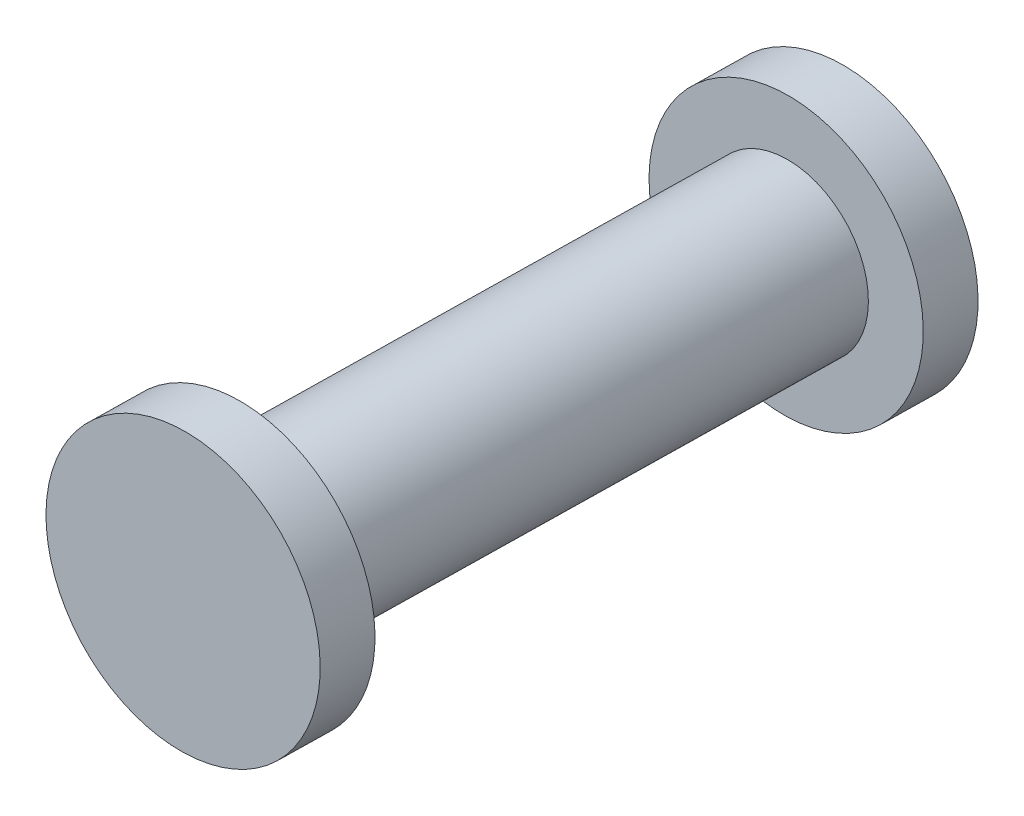
ISO-10303-21;
HEADER;
FILE_DESCRIPTION(('STEP AP214'),'2;1');
FILE_NAME('part.step','',(''),(''),'','','');
FILE_SCHEMA(('AUTOMOTIVE_DESIGN { 1 0 10303 214 1 1 1 1 }'));
ENDSEC;
DATA;
#1=APPLICATION_CONTEXT('core data for automotive mechanical design processes');
#2=APPLICATION_PROTOCOL_DEFINITION('international standard','automotive_design',2000,#1);
#3=PRODUCT_CONTEXT('',#1,'mechanical');
#4=PRODUCT('Part','Part','',(#3));
#5=PRODUCT_RELATED_PRODUCT_CATEGORY('part','',(#4));
#6=PRODUCT_DEFINITION_FORMATION('','',#4);
#7=PRODUCT_DEFINITION_CONTEXT('part definition',#1,'design');
#8=PRODUCT_DEFINITION('design','',#6,#7);
#9=PRODUCT_DEFINITION_SHAPE('','',#8);
#10=(LENGTH_UNIT() NAMED_UNIT(*) SI_UNIT(.MILLI.,.METRE.));
#11=(NAMED_UNIT(*) PLANE_ANGLE_UNIT() SI_UNIT($,.RADIAN.));
#12=(NAMED_UNIT(*) SI_UNIT($,.STERADIAN.) SOLID_ANGLE_UNIT());
#13=UNCERTAINTY_MEASURE_WITH_UNIT(LENGTH_MEASURE(1.E-05),#10,'distance_accuracy_value','');
#14=(GEOMETRIC_REPRESENTATION_CONTEXT(3) GLOBAL_UNCERTAINTY_ASSIGNED_CONTEXT((#13)) GLOBAL_UNIT_ASSIGNED_CONTEXT((#10,
#11,#12)) REPRESENTATION_CONTEXT('',''));
#15=CARTESIAN_POINT('',(0.,0.,0.));
#16=DIRECTION('',(0.,0.,1.));
#17=DIRECTION('',(1.,0.,0.));
#18=AXIS2_PLACEMENT_3D('',#15,#16,#17);
#19=CARTESIAN_POINT('',(-3.32898585000269E-12,4.37821391704974,-6.95530285000219));
#20=DIRECTION('',(4.78159178918247E-13,0.0174524064370392,0.999847695156396));
#21=DIRECTION('',(1.,0.,-4.78200812281671E-13));
#22=AXIS2_PLACEMENT_3D('',#19,#20,#21);
#23=PLANE('',#22);
#24=CARTESIAN_POINT('',(-3.34985945232846E-12,6.87783315494072,-6.99893386609478));
#25=DIRECTION('',(-4.78159178918247E-13,-0.0174524064370392,-0.999847695156396));
#26=DIRECTION('',(-1.,0.,4.78200812281671E-13));
#27=AXIS2_PLACEMENT_3D('',#24,#25,#26);
#28=CIRCLE('',#27,2.5);
#29=CARTESIAN_POINT('',(-2.50000000000335,6.87783315494072,-6.99893386609359));
#30=VERTEX_POINT('',#29);
#31=EDGE_CURVE('E53',#30,#30,#28,.T.);
#32=ORIENTED_EDGE('',*,*,#31,.T.);
#33=EDGE_LOOP('',(#32));
#34=FACE_BOUND('',#33,.T.);
#35=ADVANCED_FACE('F31',(#34),#23,.F.);
#36=CARTESIAN_POINT('',(2.3880506946905E-12,7.08726203218519,4.99923847578196));
#37=DIRECTION('',(-4.78159178918247E-13,-0.0174524064370392,-0.999847695156396));
#38=DIRECTION('',(-1.,0.,4.78200812281671E-13));
#39=AXIS2_PLACEMENT_3D('',#36,#37,#38);
#40=PLANE('',#39);
#41=CARTESIAN_POINT('',(2.3880506946905E-12,7.08726203218519,4.99923847578196));
#42=DIRECTION('',(-4.78159178918247E-13,-0.0174524064370392,-0.999847695156396));
#43=DIRECTION('',(-1.,0.,4.78200812281671E-13));
#44=AXIS2_PLACEMENT_3D('',#41,#42,#43);
#45=CIRCLE('',#44,2.5);
#46=CARTESIAN_POINT('',(-2.49999999999761,7.08726203218519,4.99923847578316));
#47=VERTEX_POINT('',#46);
#48=EDGE_CURVE('E10',#47,#47,#45,.T.);
#49=ORIENTED_EDGE('',*,*,#48,.F.);
#50=EDGE_LOOP('',(#49));
#51=FACE_BOUND('',#50,.T.);
#52=ADVANCED_FACE('F83',(#51),#40,.F.);
#53=CARTESIAN_POINT('',(-3.34985945232846E-12,6.87783315494072,-6.99893386609478));
#54=DIRECTION('',(-4.78159178918247E-13,-0.0174524064370392,-0.999847695156396));
#55=DIRECTION('',(-1.,0.,4.78200812281671E-13));
#56=AXIS2_PLACEMENT_3D('',#53,#54,#55);
#57=CYLINDRICAL_SURFACE('',#56,2.5);
#58=CARTESIAN_POINT('',(1.90989151577226E-12,7.06980962574815,3.99939078062557));
#59=DIRECTION('',(-4.78159178918247E-13,-0.0174524064370392,-0.999847695156396));
#60=DIRECTION('',(-1.,0.,4.78200812281671E-13));
#61=AXIS2_PLACEMENT_3D('',#58,#59,#60);
#62=CIRCLE('',#61,2.5);
#63=CARTESIAN_POINT('',(-2.49999999999809,7.06980962574815,3.99939078062676));
#64=VERTEX_POINT('',#63);
#65=EDGE_CURVE('E37',#64,#64,#62,.T.);
#66=ORIENTED_EDGE('',*,*,#65,.F.);
#67=EDGE_LOOP('',(#66));
#68=FACE_BOUND('',#67,.T.);
#69=ORIENTED_EDGE('',*,*,#48,.T.);
#70=EDGE_LOOP('',(#69));
#71=FACE_BOUND('',#70,.T.);
#72=ADVANCED_FACE('F78',(#68,#71),#57,.T.);
#73=CARTESIAN_POINT('',(1.93076511809803E-12,4.57019038785717,4.04302179671817));
#74=DIRECTION('',(4.78159178918247E-13,0.0174524064370392,0.999847695156396));
#75=DIRECTION('',(1.,0.,-4.78200812281671E-13));
#76=AXIS2_PLACEMENT_3D('',#73,#74,#75);
#77=PLANE('',#76);
#78=CARTESIAN_POINT('',(1.90989151577226E-12,7.06980962574815,3.99939078062557));
#79=DIRECTION('',(-4.78159178918247E-13,-0.0174524064370392,-0.999847695156396));
#80=DIRECTION('',(-1.,0.,4.78200812281671E-13));
#81=AXIS2_PLACEMENT_3D('',#78,#79,#80);
#82=CIRCLE('',#81,1.5);
#83=CARTESIAN_POINT('',(-1.49999999999809,7.06980962574815,3.99939078062628));
#84=VERTEX_POINT('',#83);
#85=EDGE_CURVE('E41',#84,#84,#82,.T.);
#86=ORIENTED_EDGE('',*,*,#85,.F.);
#87=EDGE_LOOP('',(#86));
#88=FACE_BOUND('',#87,.T.);
#89=ORIENTED_EDGE('',*,*,#65,.T.);
#90=EDGE_LOOP('',(#89));
#91=FACE_BOUND('',#90,.T.);
#92=ADVANCED_FACE('F73',(#88,#91),#77,.F.);
#93=CARTESIAN_POINT('',(-3.34985945232846E-12,6.87783315494072,-6.99893386609478));
#94=DIRECTION('',(-4.78159178918247E-13,-0.0174524064370392,-0.999847695156396));
#95=DIRECTION('',(-1.,0.,4.78200812281671E-13));
#96=AXIS2_PLACEMENT_3D('',#93,#94,#95);
#97=CYLINDRICAL_SURFACE('',#96,1.5);
#98=CARTESIAN_POINT('',(-2.87170027341022E-12,6.89528556137776,-5.99908617093839));
#99=DIRECTION('',(-4.78159178918247E-13,-0.0174524064370392,-0.999847695156396));
#100=DIRECTION('',(-1.,0.,4.78200812281671E-13));
#101=AXIS2_PLACEMENT_3D('',#98,#99,#100);
#102=CIRCLE('',#101,1.5);
#103=CARTESIAN_POINT('',(-1.50000000000287,6.89528556137776,-5.99908617093767));
#104=VERTEX_POINT('',#103);
#105=EDGE_CURVE('E45',#104,#104,#102,.T.);
#106=ORIENTED_EDGE('',*,*,#105,.F.);
#107=EDGE_LOOP('',(#106));
#108=FACE_BOUND('',#107,.T.);
#109=ORIENTED_EDGE('',*,*,#85,.T.);
#110=EDGE_LOOP('',(#109));
#111=FACE_BOUND('',#110,.T.);
#112=ADVANCED_FACE('F67',(#108,#111),#97,.T.);
#113=CARTESIAN_POINT('',(-2.85917611201475E-12,5.39551401864317,-5.97290756128283));
#114=DIRECTION('',(-4.78159178918247E-13,-0.0174524064370392,-0.999847695156396));
#115=DIRECTION('',(-1.,0.,4.78200812281671E-13));
#116=AXIS2_PLACEMENT_3D('',#113,#114,#115);
#117=PLANE('',#116);
#118=CARTESIAN_POINT('',(-2.87170027341022E-12,6.89528556137776,-5.99908617093839));
#119=DIRECTION('',(-4.78159178918247E-13,-0.0174524064370392,-0.999847695156396));
#120=DIRECTION('',(-1.,0.,4.78200812281671E-13));
#121=AXIS2_PLACEMENT_3D('',#118,#119,#120);
#122=CIRCLE('',#121,2.5);
#123=CARTESIAN_POINT('',(-2.50000000000287,6.89528556137776,-5.99908617093719));
#124=VERTEX_POINT('',#123);
#125=EDGE_CURVE('E50',#124,#124,#122,.T.);
#126=ORIENTED_EDGE('',*,*,#125,.F.);
#127=EDGE_LOOP('',(#126));
#128=FACE_BOUND('',#127,.T.);
#129=ORIENTED_EDGE('',*,*,#105,.T.);
#130=EDGE_LOOP('',(#129));
#131=FACE_BOUND('',#130,.T.);
#132=ADVANCED_FACE('F61',(#128,#131),#117,.F.);
#133=CARTESIAN_POINT('',(-3.34985945232846E-12,6.87783315494072,-6.99893386609478));
#134=DIRECTION('',(-4.78159178918247E-13,-0.0174524064370392,-0.999847695156396));
#135=DIRECTION('',(-1.,0.,4.78200812281671E-13));
#136=AXIS2_PLACEMENT_3D('',#133,#134,#135);
#137=CYLINDRICAL_SURFACE('',#136,2.5);
#138=ORIENTED_EDGE('',*,*,#31,.F.);
#139=EDGE_LOOP('',(#138));
#140=FACE_BOUND('',#139,.T.);
#141=ORIENTED_EDGE('',*,*,#125,.T.);
#142=EDGE_LOOP('',(#141));
#143=FACE_BOUND('',#142,.T.);
#144=ADVANCED_FACE('F58',(#140,#143),#137,.T.);
#145=CLOSED_SHELL('',(#35,#52,#72,#92,#112,#132,#144));
#146=MANIFOLD_SOLID_BREP('B2',#145);
#147=ADVANCED_BREP_SHAPE_REPRESENTATION('',(#18,#146),#14);
#148=SHAPE_DEFINITION_REPRESENTATION(#9,#147);
ENDSEC;
END-ISO-10303-21;
